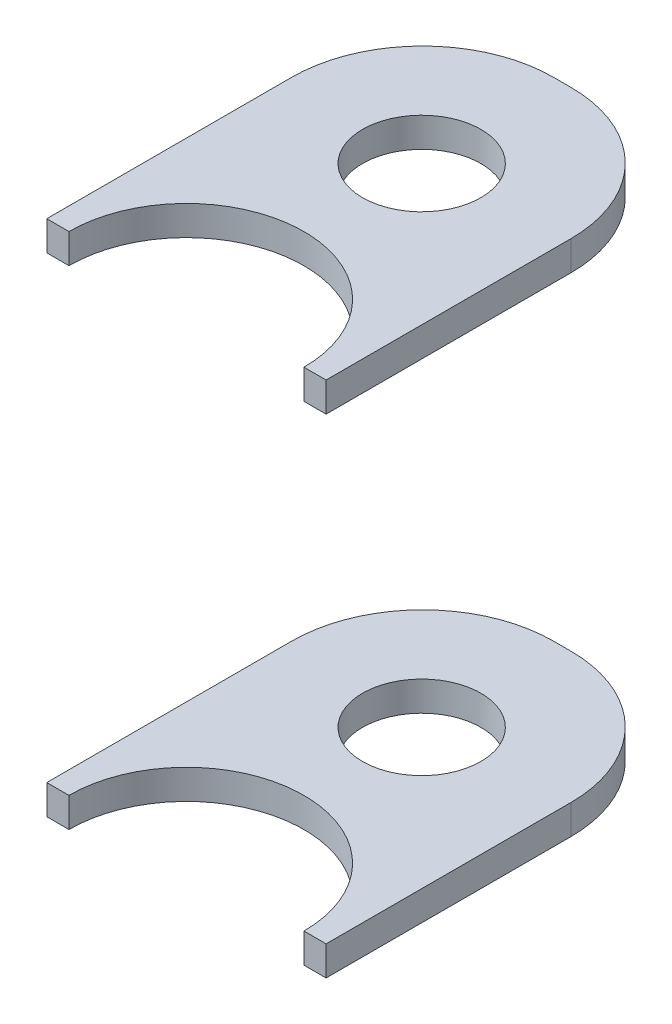
ISO-10303-21;
HEADER;
FILE_DESCRIPTION(('STEP AP214'),'2;1');
FILE_NAME('part.step','',(''),(''),'','','');
FILE_SCHEMA(('AUTOMOTIVE_DESIGN { 1 0 10303 214 1 1 1 1 }'));
ENDSEC;
DATA;
#1=APPLICATION_CONTEXT('core data for automotive mechanical design processes');
#2=APPLICATION_PROTOCOL_DEFINITION('international standard','automotive_design',2000,#1);
#3=PRODUCT_CONTEXT('',#1,'mechanical');
#4=PRODUCT('Part','Part','',(#3));
#5=PRODUCT_RELATED_PRODUCT_CATEGORY('part','',(#4));
#6=PRODUCT_DEFINITION_FORMATION('','',#4);
#7=PRODUCT_DEFINITION_CONTEXT('part definition',#1,'design');
#8=PRODUCT_DEFINITION('design','',#6,#7);
#9=PRODUCT_DEFINITION_SHAPE('','',#8);
#10=(LENGTH_UNIT() NAMED_UNIT(*) SI_UNIT(.MILLI.,.METRE.));
#11=(NAMED_UNIT(*) PLANE_ANGLE_UNIT() SI_UNIT($,.RADIAN.));
#12=(NAMED_UNIT(*) SI_UNIT($,.STERADIAN.) SOLID_ANGLE_UNIT());
#13=UNCERTAINTY_MEASURE_WITH_UNIT(LENGTH_MEASURE(1.E-05),#10,'distance_accuracy_value','');
#14=(GEOMETRIC_REPRESENTATION_CONTEXT(3) GLOBAL_UNCERTAINTY_ASSIGNED_CONTEXT((#13)) GLOBAL_UNIT_ASSIGNED_CONTEXT((#10,
#11,#12)) REPRESENTATION_CONTEXT('',''));
#15=CARTESIAN_POINT('',(0.,0.,0.));
#16=DIRECTION('',(0.,0.,1.));
#17=DIRECTION('',(1.,0.,0.));
#18=AXIS2_PLACEMENT_3D('',#15,#16,#17);
#19=CARTESIAN_POINT('',(0.,-35.,31.8));
#20=DIRECTION('',(0.,-1.,0.));
#21=DIRECTION('',(0.,0.,1.));
#22=AXIS2_PLACEMENT_3D('',#19,#20,#21);
#23=PLANE('',#22);
#24=DIRECTION('',(0.,0.,-1.));
#25=VECTOR('',#24,1.);
#26=CARTESIAN_POINT('',(18.88,-35.,-1.30100000000001));
#27=LINE('',#26,#25);
#28=CARTESIAN_POINT('',(18.88,-35.,31.8));
#29=VERTEX_POINT('',#28);
#30=CARTESIAN_POINT('',(18.88,-35.,-1.30100000000001));
#31=VERTEX_POINT('',#30);
#32=EDGE_CURVE('E167',#29,#31,#27,.T.);
#33=ORIENTED_EDGE('',*,*,#32,.F.);
#34=DIRECTION('',(1.,0.,0.));
#35=VECTOR('',#34,1.);
#36=CARTESIAN_POINT('',(18.88,-35.,31.8));
#37=LINE('',#36,#35);
#38=CARTESIAN_POINT('',(15.88,-35.,31.8));
#39=VERTEX_POINT('',#38);
#40=EDGE_CURVE('E141',#39,#29,#37,.T.);
#41=ORIENTED_EDGE('',*,*,#40,.F.);
#42=CARTESIAN_POINT('',(0.,-35.,31.8));
#43=DIRECTION('',(0.,-1.,0.));
#44=DIRECTION('',(0.,0.,1.));
#45=AXIS2_PLACEMENT_3D('',#42,#43,#44);
#46=CIRCLE('',#45,15.88);
#47=CARTESIAN_POINT('',(-15.88,-35.,31.8));
#48=VERTEX_POINT('',#47);
#49=EDGE_CURVE('E122',#48,#39,#46,.T.);
#50=ORIENTED_EDGE('',*,*,#49,.F.);
#51=DIRECTION('',(1.,0.,0.));
#52=VECTOR('',#51,1.);
#53=CARTESIAN_POINT('',(-15.88,-35.,31.8));
#54=LINE('',#53,#52);
#55=CARTESIAN_POINT('',(-18.88,-35.,31.8));
#56=VERTEX_POINT('',#55);
#57=EDGE_CURVE('E132',#56,#48,#54,.T.);
#58=ORIENTED_EDGE('',*,*,#57,.F.);
#59=DIRECTION('',(0.,0.,1.));
#60=VECTOR('',#59,1.);
#61=CARTESIAN_POINT('',(-18.88,-35.,31.8));
#62=LINE('',#61,#60);
#63=CARTESIAN_POINT('',(-18.88,-35.,-1.30100000000001));
#64=VERTEX_POINT('',#63);
#65=EDGE_CURVE('E137',#64,#56,#62,.T.);
#66=ORIENTED_EDGE('',*,*,#65,.F.);
#67=CARTESIAN_POINT('',(-1.181,-35.,-1.30100000000001));
#68=DIRECTION('',(0.,1.,0.));
#69=DIRECTION('',(0.,0.,1.));
#70=AXIS2_PLACEMENT_3D('',#67,#68,#69);
#71=CIRCLE('',#70,17.699);
#72=CARTESIAN_POINT('',(-1.181,-35.,-19.));
#73=VERTEX_POINT('',#72);
#74=EDGE_CURVE('E193',#73,#64,#71,.T.);
#75=ORIENTED_EDGE('',*,*,#74,.F.);
#76=DIRECTION('',(-1.,0.,0.));
#77=VECTOR('',#76,1.);
#78=CARTESIAN_POINT('',(-1.181,-35.,-19.));
#79=LINE('',#78,#77);
#80=CARTESIAN_POINT('',(1.181,-35.,-19.));
#81=VERTEX_POINT('',#80);
#82=EDGE_CURVE('E186',#81,#73,#79,.T.);
#83=ORIENTED_EDGE('',*,*,#82,.F.);
#84=CARTESIAN_POINT('',(1.181,-35.,-1.30100000000001));
#85=DIRECTION('',(0.,1.,0.));
#86=DIRECTION('',(0.,0.,-1.));
#87=AXIS2_PLACEMENT_3D('',#84,#85,#86);
#88=CIRCLE('',#87,17.699);
#89=EDGE_CURVE('E176',#31,#81,#88,.T.);
#90=ORIENTED_EDGE('',*,*,#89,.F.);
#91=EDGE_LOOP('',(#33,#41,#50,#58,#66,#75,#83,#90));
#92=FACE_BOUND('',#91,.T.);
#93=CARTESIAN_POINT('',(0.,-35.,0.));
#94=DIRECTION('',(0.,1.,0.));
#95=DIRECTION('',(0.,0.,1.));
#96=AXIS2_PLACEMENT_3D('',#93,#94,#95);
#97=CIRCLE('',#96,8.);
#98=CARTESIAN_POINT('',(0.,-35.,8.));
#99=VERTEX_POINT('',#98);
#100=EDGE_CURVE('E150',#99,#99,#97,.T.);
#101=ORIENTED_EDGE('',*,*,#100,.T.);
#102=EDGE_LOOP('',(#101));
#103=FACE_BOUND('',#102,.T.);
#104=ADVANCED_FACE('F49',(#92,#103),#23,.T.);
#105=CARTESIAN_POINT('',(0.,-31.,31.8));
#106=DIRECTION('',(0.,-1.,0.));
#107=DIRECTION('',(0.,0.,1.));
#108=AXIS2_PLACEMENT_3D('',#105,#106,#107);
#109=PLANE('',#108);
#110=DIRECTION('',(0.,0.,-1.));
#111=VECTOR('',#110,1.);
#112=CARTESIAN_POINT('',(18.88,-31.,-1.30100000000001));
#113=LINE('',#112,#111);
#114=CARTESIAN_POINT('',(18.88,-31.,31.8));
#115=VERTEX_POINT('',#114);
#116=CARTESIAN_POINT('',(18.88,-31.,-1.30100000000001));
#117=VERTEX_POINT('',#116);
#118=EDGE_CURVE('E146',#115,#117,#113,.T.);
#119=ORIENTED_EDGE('',*,*,#118,.T.);
#120=CARTESIAN_POINT('',(1.181,-31.,-1.30100000000001));
#121=DIRECTION('',(0.,1.,0.));
#122=DIRECTION('',(0.,0.,-1.));
#123=AXIS2_PLACEMENT_3D('',#120,#121,#122);
#124=CIRCLE('',#123,17.699);
#125=CARTESIAN_POINT('',(1.181,-31.,-19.));
#126=VERTEX_POINT('',#125);
#127=EDGE_CURVE('E149',#117,#126,#124,.T.);
#128=ORIENTED_EDGE('',*,*,#127,.T.);
#129=DIRECTION('',(-1.,0.,0.));
#130=VECTOR('',#129,1.);
#131=CARTESIAN_POINT('',(-1.181,-31.,-19.));
#132=LINE('',#131,#130);
#133=CARTESIAN_POINT('',(-1.181,-31.,-19.));
#134=VERTEX_POINT('',#133);
#135=EDGE_CURVE('E153',#126,#134,#132,.T.);
#136=ORIENTED_EDGE('',*,*,#135,.T.);
#137=CARTESIAN_POINT('',(-1.181,-31.,-1.30100000000001));
#138=DIRECTION('',(0.,1.,0.));
#139=DIRECTION('',(0.,0.,1.));
#140=AXIS2_PLACEMENT_3D('',#137,#138,#139);
#141=CIRCLE('',#140,17.699);
#142=CARTESIAN_POINT('',(-18.88,-31.,-1.30100000000001));
#143=VERTEX_POINT('',#142);
#144=EDGE_CURVE('E156',#134,#143,#141,.T.);
#145=ORIENTED_EDGE('',*,*,#144,.T.);
#146=DIRECTION('',(0.,0.,1.));
#147=VECTOR('',#146,1.);
#148=CARTESIAN_POINT('',(-18.88,-31.,31.8));
#149=LINE('',#148,#147);
#150=CARTESIAN_POINT('',(-18.88,-31.,31.8));
#151=VERTEX_POINT('',#150);
#152=EDGE_CURVE('E159',#143,#151,#149,.T.);
#153=ORIENTED_EDGE('',*,*,#152,.T.);
#154=DIRECTION('',(1.,0.,0.));
#155=VECTOR('',#154,1.);
#156=CARTESIAN_POINT('',(-15.88,-31.,31.8));
#157=LINE('',#156,#155);
#158=CARTESIAN_POINT('',(-15.88,-31.,31.8));
#159=VERTEX_POINT('',#158);
#160=EDGE_CURVE('E162',#151,#159,#157,.T.);
#161=ORIENTED_EDGE('',*,*,#160,.T.);
#162=CARTESIAN_POINT('',(0.,-31.,31.8));
#163=DIRECTION('',(0.,-1.,0.));
#164=DIRECTION('',(0.,0.,1.));
#165=AXIS2_PLACEMENT_3D('',#162,#163,#164);
#166=CIRCLE('',#165,15.88);
#167=CARTESIAN_POINT('',(15.88,-31.,31.8));
#168=VERTEX_POINT('',#167);
#169=EDGE_CURVE('E125',#159,#168,#166,.T.);
#170=ORIENTED_EDGE('',*,*,#169,.T.);
#171=DIRECTION('',(1.,0.,0.));
#172=VECTOR('',#171,1.);
#173=CARTESIAN_POINT('',(18.88,-31.,31.8));
#174=LINE('',#173,#172);
#175=EDGE_CURVE('E165',#168,#115,#174,.T.);
#176=ORIENTED_EDGE('',*,*,#175,.T.);
#177=EDGE_LOOP('',(#119,#128,#136,#145,#153,#161,#170,#176));
#178=FACE_BOUND('',#177,.T.);
#179=CARTESIAN_POINT('',(0.,-31.,0.));
#180=DIRECTION('',(0.,1.,0.));
#181=DIRECTION('',(0.,0.,1.));
#182=AXIS2_PLACEMENT_3D('',#179,#180,#181);
#183=CIRCLE('',#182,8.);
#184=CARTESIAN_POINT('',(0.,-31.,8.));
#185=VERTEX_POINT('',#184);
#186=EDGE_CURVE('E189',#185,#185,#183,.T.);
#187=ORIENTED_EDGE('',*,*,#186,.F.);
#188=EDGE_LOOP('',(#187));
#189=FACE_BOUND('',#188,.T.);
#190=ADVANCED_FACE('F183',(#178,#189),#109,.F.);
#191=CARTESIAN_POINT('',(18.88,-35.,-1.30100000000001));
#192=DIRECTION('',(-1.,0.,0.));
#193=DIRECTION('',(0.,0.,1.));
#194=AXIS2_PLACEMENT_3D('',#191,#192,#193);
#195=PLANE('',#194);
#196=ORIENTED_EDGE('',*,*,#118,.F.);
#197=DIRECTION('',(0.,1.,0.));
#198=VECTOR('',#197,1.);
#199=CARTESIAN_POINT('',(18.88,-35.,31.8));
#200=LINE('',#199,#198);
#201=EDGE_CURVE('E66',#29,#115,#200,.T.);
#202=ORIENTED_EDGE('',*,*,#201,.F.);
#203=ORIENTED_EDGE('',*,*,#32,.T.);
#204=DIRECTION('',(0.,1.,0.));
#205=VECTOR('',#204,1.);
#206=CARTESIAN_POINT('',(18.88,-35.,-1.30100000000001));
#207=LINE('',#206,#205);
#208=EDGE_CURVE('E12',#31,#117,#207,.T.);
#209=ORIENTED_EDGE('',*,*,#208,.T.);
#210=EDGE_LOOP('',(#196,#202,#203,#209));
#211=FACE_BOUND('',#210,.T.);
#212=ADVANCED_FACE('F51',(#211),#195,.F.);
#213=CARTESIAN_POINT('',(1.181,-35.,-1.30100000000001));
#214=DIRECTION('',(0.,1.,0.));
#215=DIRECTION('',(0.,0.,-1.));
#216=AXIS2_PLACEMENT_3D('',#213,#214,#215);
#217=CYLINDRICAL_SURFACE('',#216,17.699);
#218=ORIENTED_EDGE('',*,*,#127,.F.);
#219=ORIENTED_EDGE('',*,*,#208,.F.);
#220=ORIENTED_EDGE('',*,*,#89,.T.);
#221=DIRECTION('',(0.,1.,0.));
#222=VECTOR('',#221,1.);
#223=CARTESIAN_POINT('',(1.181,-35.,-19.));
#224=LINE('',#223,#222);
#225=EDGE_CURVE('E58',#81,#126,#224,.T.);
#226=ORIENTED_EDGE('',*,*,#225,.T.);
#227=EDGE_LOOP('',(#218,#219,#220,#226));
#228=FACE_BOUND('',#227,.T.);
#229=ADVANCED_FACE('F175',(#228),#217,.T.);
#230=CARTESIAN_POINT('',(-1.181,-35.,-19.));
#231=DIRECTION('',(0.,0.,1.));
#232=DIRECTION('',(1.,0.,0.));
#233=AXIS2_PLACEMENT_3D('',#230,#231,#232);
#234=PLANE('',#233);
#235=ORIENTED_EDGE('',*,*,#135,.F.);
#236=ORIENTED_EDGE('',*,*,#225,.F.);
#237=ORIENTED_EDGE('',*,*,#82,.T.);
#238=DIRECTION('',(0.,1.,0.));
#239=VECTOR('',#238,1.);
#240=CARTESIAN_POINT('',(-1.181,-35.,-19.));
#241=LINE('',#240,#239);
#242=EDGE_CURVE('E173',#73,#134,#241,.T.);
#243=ORIENTED_EDGE('',*,*,#242,.T.);
#244=EDGE_LOOP('',(#235,#236,#237,#243));
#245=FACE_BOUND('',#244,.T.);
#246=ADVANCED_FACE('F180',(#245),#234,.F.);
#247=CARTESIAN_POINT('',(-1.181,-35.,-1.30100000000001));
#248=DIRECTION('',(0.,1.,0.));
#249=DIRECTION('',(0.,0.,-1.));
#250=AXIS2_PLACEMENT_3D('',#247,#248,#249);
#251=CYLINDRICAL_SURFACE('',#250,17.699);
#252=ORIENTED_EDGE('',*,*,#144,.F.);
#253=ORIENTED_EDGE('',*,*,#242,.F.);
#254=ORIENTED_EDGE('',*,*,#74,.T.);
#255=DIRECTION('',(0.,1.,0.));
#256=VECTOR('',#255,1.);
#257=CARTESIAN_POINT('',(-18.88,-35.,-1.30100000000001));
#258=LINE('',#257,#256);
#259=EDGE_CURVE('E171',#64,#143,#258,.T.);
#260=ORIENTED_EDGE('',*,*,#259,.T.);
#261=EDGE_LOOP('',(#252,#253,#254,#260));
#262=FACE_BOUND('',#261,.T.);
#263=ADVANCED_FACE('F200',(#262),#251,.T.);
#264=CARTESIAN_POINT('',(-18.88,-35.,31.8));
#265=DIRECTION('',(1.,0.,0.));
#266=DIRECTION('',(0.,0.,-1.));
#267=AXIS2_PLACEMENT_3D('',#264,#265,#266);
#268=PLANE('',#267);
#269=ORIENTED_EDGE('',*,*,#152,.F.);
#270=ORIENTED_EDGE('',*,*,#259,.F.);
#271=ORIENTED_EDGE('',*,*,#65,.T.);
#272=DIRECTION('',(0.,1.,0.));
#273=VECTOR('',#272,1.);
#274=CARTESIAN_POINT('',(-18.88,-35.,31.8));
#275=LINE('',#274,#273);
#276=EDGE_CURVE('E129',#56,#151,#275,.T.);
#277=ORIENTED_EDGE('',*,*,#276,.T.);
#278=EDGE_LOOP('',(#269,#270,#271,#277));
#279=FACE_BOUND('',#278,.T.);
#280=ADVANCED_FACE('F197',(#279),#268,.F.);
#281=CARTESIAN_POINT('',(-15.88,-35.,31.8));
#282=DIRECTION('',(0.,0.,-1.));
#283=DIRECTION('',(-1.,0.,0.));
#284=AXIS2_PLACEMENT_3D('',#281,#282,#283);
#285=PLANE('',#284);
#286=ORIENTED_EDGE('',*,*,#160,.F.);
#287=ORIENTED_EDGE('',*,*,#276,.F.);
#288=ORIENTED_EDGE('',*,*,#57,.T.);
#289=DIRECTION('',(0.,1.,0.));
#290=VECTOR('',#289,1.);
#291=CARTESIAN_POINT('',(-15.88,-35.,31.8));
#292=LINE('',#291,#290);
#293=EDGE_CURVE('E118',#48,#159,#292,.T.);
#294=ORIENTED_EDGE('',*,*,#293,.T.);
#295=EDGE_LOOP('',(#286,#287,#288,#294));
#296=FACE_BOUND('',#295,.T.);
#297=ADVANCED_FACE('F133',(#296),#285,.F.);
#298=CARTESIAN_POINT('',(0.,-35.,31.8));
#299=DIRECTION('',(0.,1.,0.));
#300=DIRECTION('',(0.,0.,-1.));
#301=AXIS2_PLACEMENT_3D('',#298,#299,#300);
#302=CYLINDRICAL_SURFACE('',#301,15.88);
#303=ORIENTED_EDGE('',*,*,#169,.F.);
#304=ORIENTED_EDGE('',*,*,#293,.F.);
#305=ORIENTED_EDGE('',*,*,#49,.T.);
#306=DIRECTION('',(0.,1.,0.));
#307=VECTOR('',#306,1.);
#308=CARTESIAN_POINT('',(15.88,-35.,31.8));
#309=LINE('',#308,#307);
#310=EDGE_CURVE('E94',#39,#168,#309,.T.);
#311=ORIENTED_EDGE('',*,*,#310,.T.);
#312=EDGE_LOOP('',(#303,#304,#305,#311));
#313=FACE_BOUND('',#312,.T.);
#314=ADVANCED_FACE('F120',(#313),#302,.F.);
#315=CARTESIAN_POINT('',(18.88,-35.,31.8));
#316=DIRECTION('',(0.,0.,-1.));
#317=DIRECTION('',(-1.,0.,0.));
#318=AXIS2_PLACEMENT_3D('',#315,#316,#317);
#319=PLANE('',#318);
#320=ORIENTED_EDGE('',*,*,#175,.F.);
#321=ORIENTED_EDGE('',*,*,#310,.F.);
#322=ORIENTED_EDGE('',*,*,#40,.T.);
#323=ORIENTED_EDGE('',*,*,#201,.T.);
#324=EDGE_LOOP('',(#320,#321,#322,#323));
#325=FACE_BOUND('',#324,.T.);
#326=ADVANCED_FACE('F218',(#325),#319,.F.);
#327=CARTESIAN_POINT('',(0.,-35.,0.));
#328=DIRECTION('',(0.,1.,0.));
#329=DIRECTION('',(0.,0.,-1.));
#330=AXIS2_PLACEMENT_3D('',#327,#328,#329);
#331=CYLINDRICAL_SURFACE('',#330,8.);
#332=ORIENTED_EDGE('',*,*,#100,.F.);
#333=EDGE_LOOP('',(#332));
#334=FACE_BOUND('',#333,.T.);
#335=ORIENTED_EDGE('',*,*,#186,.T.);
#336=EDGE_LOOP('',(#335));
#337=FACE_BOUND('',#336,.T.);
#338=ADVANCED_FACE('F216',(#334,#337),#331,.F.);
#339=CLOSED_SHELL('',(#104,#190,#212,#229,#246,#263,#280,#297,#314,#326,#338));
#340=MANIFOLD_SOLID_BREP('B2',#339);
#341=CARTESIAN_POINT('',(0.,35.,31.8));
#342=DIRECTION('',(0.,1.,0.));
#343=DIRECTION('',(0.,0.,1.));
#344=AXIS2_PLACEMENT_3D('',#341,#342,#343);
#345=PLANE('',#344);
#346=DIRECTION('',(0.,0.,-1.));
#347=VECTOR('',#346,1.);
#348=CARTESIAN_POINT('',(18.88,35.,-1.30100000000001));
#349=LINE('',#348,#347);
#350=CARTESIAN_POINT('',(18.88,35.,31.8));
#351=VERTEX_POINT('',#350);
#352=CARTESIAN_POINT('',(18.88,35.,-1.30100000000001));
#353=VERTEX_POINT('',#352);
#354=EDGE_CURVE('E454',#351,#353,#349,.T.);
#355=ORIENTED_EDGE('',*,*,#354,.T.);
#356=CARTESIAN_POINT('',(1.181,35.,-1.30100000000001));
#357=DIRECTION('',(0.,1.,0.));
#358=DIRECTION('',(0.,0.,-1.));
#359=AXIS2_PLACEMENT_3D('',#356,#357,#358);
#360=CIRCLE('',#359,17.699);
#361=CARTESIAN_POINT('',(1.181,35.,-19.));
#362=VERTEX_POINT('',#361);
#363=EDGE_CURVE('E402',#353,#362,#360,.T.);
#364=ORIENTED_EDGE('',*,*,#363,.T.);
#365=DIRECTION('',(-1.,0.,0.));
#366=VECTOR('',#365,1.);
#367=CARTESIAN_POINT('',(-1.181,35.,-19.));
#368=LINE('',#367,#366);
#369=CARTESIAN_POINT('',(-1.181,35.,-19.));
#370=VERTEX_POINT('',#369);
#371=EDGE_CURVE('E469',#362,#370,#368,.T.);
#372=ORIENTED_EDGE('',*,*,#371,.T.);
#373=CARTESIAN_POINT('',(-1.181,35.,-1.30100000000001));
#374=DIRECTION('',(0.,1.,0.));
#375=DIRECTION('',(0.,0.,1.));
#376=AXIS2_PLACEMENT_3D('',#373,#374,#375);
#377=CIRCLE('',#376,17.699);
#378=CARTESIAN_POINT('',(-18.88,35.,-1.30100000000001));
#379=VERTEX_POINT('',#378);
#380=EDGE_CURVE('E482',#370,#379,#377,.T.);
#381=ORIENTED_EDGE('',*,*,#380,.T.);
#382=DIRECTION('',(0.,0.,1.));
#383=VECTOR('',#382,1.);
#384=CARTESIAN_POINT('',(-18.88,35.,31.8));
#385=LINE('',#384,#383);
#386=CARTESIAN_POINT('',(-18.88,35.,31.8));
#387=VERTEX_POINT('',#386);
#388=EDGE_CURVE('E421',#379,#387,#385,.T.);
#389=ORIENTED_EDGE('',*,*,#388,.T.);
#390=DIRECTION('',(1.,0.,0.));
#391=VECTOR('',#390,1.);
#392=CARTESIAN_POINT('',(-15.88,35.,31.8));
#393=LINE('',#392,#391);
#394=CARTESIAN_POINT('',(-15.88,35.,31.8));
#395=VERTEX_POINT('',#394);
#396=EDGE_CURVE('E415',#387,#395,#393,.T.);
#397=ORIENTED_EDGE('',*,*,#396,.T.);
#398=CARTESIAN_POINT('',(0.,35.,31.8));
#399=DIRECTION('',(0.,-1.,0.));
#400=DIRECTION('',(0.,0.,1.));
#401=AXIS2_PLACEMENT_3D('',#398,#399,#400);
#402=CIRCLE('',#401,15.88);
#403=CARTESIAN_POINT('',(15.88,35.,31.8));
#404=VERTEX_POINT('',#403);
#405=EDGE_CURVE('E419',#395,#404,#402,.T.);
#406=ORIENTED_EDGE('',*,*,#405,.T.);
#407=DIRECTION('',(1.,0.,0.));
#408=VECTOR('',#407,1.);
#409=CARTESIAN_POINT('',(18.88,35.,31.8));
#410=LINE('',#409,#408);
#411=EDGE_CURVE('E359',#404,#351,#410,.T.);
#412=ORIENTED_EDGE('',*,*,#411,.T.);
#413=EDGE_LOOP('',(#355,#364,#372,#381,#389,#397,#406,#412));
#414=FACE_BOUND('',#413,.T.);
#415=CARTESIAN_POINT('',(0.,35.,0.));
#416=DIRECTION('',(0.,1.,0.));
#417=DIRECTION('',(0.,0.,1.));
#418=AXIS2_PLACEMENT_3D('',#415,#416,#417);
#419=CIRCLE('',#418,8.);
#420=CARTESIAN_POINT('',(0.,35.,8.));
#421=VERTEX_POINT('',#420);
#422=EDGE_CURVE('E443',#421,#421,#419,.T.);
#423=ORIENTED_EDGE('',*,*,#422,.F.);
#424=EDGE_LOOP('',(#423));
#425=FACE_BOUND('',#424,.T.);
#426=ADVANCED_FACE('F342',(#414,#425),#345,.T.);
#427=CARTESIAN_POINT('',(0.,31.,31.8));
#428=DIRECTION('',(0.,1.,0.));
#429=DIRECTION('',(0.,0.,1.));
#430=AXIS2_PLACEMENT_3D('',#427,#428,#429);
#431=PLANE('',#430);
#432=DIRECTION('',(0.,0.,-1.));
#433=VECTOR('',#432,1.);
#434=CARTESIAN_POINT('',(18.88,31.,-1.30100000000001));
#435=LINE('',#434,#433);
#436=CARTESIAN_POINT('',(18.88,31.,31.8));
#437=VERTEX_POINT('',#436);
#438=CARTESIAN_POINT('',(18.88,31.,-1.30100000000001));
#439=VERTEX_POINT('',#438);
#440=EDGE_CURVE('E439',#437,#439,#435,.T.);
#441=ORIENTED_EDGE('',*,*,#440,.F.);
#442=DIRECTION('',(1.,0.,0.));
#443=VECTOR('',#442,1.);
#444=CARTESIAN_POINT('',(18.88,31.,31.8));
#445=LINE('',#444,#443);
#446=CARTESIAN_POINT('',(15.88,31.,31.8));
#447=VERTEX_POINT('',#446);
#448=EDGE_CURVE('E394',#447,#437,#445,.T.);
#449=ORIENTED_EDGE('',*,*,#448,.F.);
#450=CARTESIAN_POINT('',(0.,31.,31.8));
#451=DIRECTION('',(0.,-1.,0.));
#452=DIRECTION('',(0.,0.,1.));
#453=AXIS2_PLACEMENT_3D('',#450,#451,#452);
#454=CIRCLE('',#453,15.88);
#455=CARTESIAN_POINT('',(-15.88,31.,31.8));
#456=VERTEX_POINT('',#455);
#457=EDGE_CURVE('E388',#456,#447,#454,.T.);
#458=ORIENTED_EDGE('',*,*,#457,.F.);
#459=DIRECTION('',(1.,0.,0.));
#460=VECTOR('',#459,1.);
#461=CARTESIAN_POINT('',(-15.88,31.,31.8));
#462=LINE('',#461,#460);
#463=CARTESIAN_POINT('',(-18.88,31.,31.8));
#464=VERTEX_POINT('',#463);
#465=EDGE_CURVE('E429',#464,#456,#462,.T.);
#466=ORIENTED_EDGE('',*,*,#465,.F.);
#467=DIRECTION('',(0.,0.,1.));
#468=VECTOR('',#467,1.);
#469=CARTESIAN_POINT('',(-18.88,31.,31.8));
#470=LINE('',#469,#468);
#471=CARTESIAN_POINT('',(-18.88,31.,-1.30100000000001));
#472=VERTEX_POINT('',#471);
#473=EDGE_CURVE('E449',#472,#464,#470,.T.);
#474=ORIENTED_EDGE('',*,*,#473,.F.);
#475=CARTESIAN_POINT('',(-1.181,31.,-1.30100000000001));
#476=DIRECTION('',(0.,1.,0.));
#477=DIRECTION('',(0.,0.,1.));
#478=AXIS2_PLACEMENT_3D('',#475,#476,#477);
#479=CIRCLE('',#478,17.699);
#480=CARTESIAN_POINT('',(-1.181,31.,-19.));
#481=VERTEX_POINT('',#480);
#482=EDGE_CURVE('E447',#481,#472,#479,.T.);
#483=ORIENTED_EDGE('',*,*,#482,.F.);
#484=DIRECTION('',(-1.,0.,0.));
#485=VECTOR('',#484,1.);
#486=CARTESIAN_POINT('',(-1.181,31.,-19.));
#487=LINE('',#486,#485);
#488=CARTESIAN_POINT('',(1.181,31.,-19.));
#489=VERTEX_POINT('',#488);
#490=EDGE_CURVE('E445',#489,#481,#487,.T.);
#491=ORIENTED_EDGE('',*,*,#490,.F.);
#492=CARTESIAN_POINT('',(1.181,31.,-1.30100000000001));
#493=DIRECTION('',(0.,1.,0.));
#494=DIRECTION('',(0.,0.,-1.));
#495=AXIS2_PLACEMENT_3D('',#492,#493,#494);
#496=CIRCLE('',#495,17.699);
#497=EDGE_CURVE('E442',#439,#489,#496,.T.);
#498=ORIENTED_EDGE('',*,*,#497,.F.);
#499=EDGE_LOOP('',(#441,#449,#458,#466,#474,#483,#491,#498));
#500=FACE_BOUND('',#499,.T.);
#501=CARTESIAN_POINT('',(0.,31.,0.));
#502=DIRECTION('',(0.,1.,0.));
#503=DIRECTION('',(0.,0.,1.));
#504=AXIS2_PLACEMENT_3D('',#501,#502,#503);
#505=CIRCLE('',#504,8.);
#506=CARTESIAN_POINT('',(0.,31.,8.));
#507=VERTEX_POINT('',#506);
#508=EDGE_CURVE('E488',#507,#507,#505,.T.);
#509=ORIENTED_EDGE('',*,*,#508,.T.);
#510=EDGE_LOOP('',(#509));
#511=FACE_BOUND('',#510,.T.);
#512=ADVANCED_FACE('F473',(#500,#511),#431,.F.);
#513=CARTESIAN_POINT('',(18.88,35.,-1.30100000000001));
#514=DIRECTION('',(-1.,0.,0.));
#515=DIRECTION('',(0.,0.,1.));
#516=AXIS2_PLACEMENT_3D('',#513,#514,#515);
#517=PLANE('',#516);
#518=ORIENTED_EDGE('',*,*,#440,.T.);
#519=DIRECTION('',(0.,-1.,0.));
#520=VECTOR('',#519,1.);
#521=CARTESIAN_POINT('',(18.88,35.,-1.30100000000001));
#522=LINE('',#521,#520);
#523=EDGE_CURVE('E47',#353,#439,#522,.T.);
#524=ORIENTED_EDGE('',*,*,#523,.F.);
#525=ORIENTED_EDGE('',*,*,#354,.F.);
#526=DIRECTION('',(0.,-1.,0.));
#527=VECTOR('',#526,1.);
#528=CARTESIAN_POINT('',(18.88,35.,31.8));
#529=LINE('',#528,#527);
#530=EDGE_CURVE('E435',#351,#437,#529,.T.);
#531=ORIENTED_EDGE('',*,*,#530,.T.);
#532=EDGE_LOOP('',(#518,#524,#525,#531));
#533=FACE_BOUND('',#532,.T.);
#534=ADVANCED_FACE('F344',(#533),#517,.F.);
#535=CARTESIAN_POINT('',(1.181,35.,-1.30100000000001));
#536=DIRECTION('',(0.,-1.,0.));
#537=DIRECTION('',(0.,0.,-1.));
#538=AXIS2_PLACEMENT_3D('',#535,#536,#537);
#539=CYLINDRICAL_SURFACE('',#538,17.699);
#540=ORIENTED_EDGE('',*,*,#497,.T.);
#541=DIRECTION('',(0.,-1.,0.));
#542=VECTOR('',#541,1.);
#543=CARTESIAN_POINT('',(1.181,35.,-19.));
#544=LINE('',#543,#542);
#545=EDGE_CURVE('E351',#362,#489,#544,.T.);
#546=ORIENTED_EDGE('',*,*,#545,.F.);
#547=ORIENTED_EDGE('',*,*,#363,.F.);
#548=ORIENTED_EDGE('',*,*,#523,.T.);
#549=EDGE_LOOP('',(#540,#546,#547,#548));
#550=FACE_BOUND('',#549,.T.);
#551=ADVANCED_FACE('F516',(#550),#539,.T.);
#552=CARTESIAN_POINT('',(-1.181,35.,-19.));
#553=DIRECTION('',(0.,0.,1.));
#554=DIRECTION('',(1.,0.,0.));
#555=AXIS2_PLACEMENT_3D('',#552,#553,#554);
#556=PLANE('',#555);
#557=ORIENTED_EDGE('',*,*,#490,.T.);
#558=DIRECTION('',(0.,-1.,0.));
#559=VECTOR('',#558,1.);
#560=CARTESIAN_POINT('',(-1.181,35.,-19.));
#561=LINE('',#560,#559);
#562=EDGE_CURVE('E461',#370,#481,#561,.T.);
#563=ORIENTED_EDGE('',*,*,#562,.F.);
#564=ORIENTED_EDGE('',*,*,#371,.F.);
#565=ORIENTED_EDGE('',*,*,#545,.T.);
#566=EDGE_LOOP('',(#557,#563,#564,#565));
#567=FACE_BOUND('',#566,.T.);
#568=ADVANCED_FACE('F467',(#567),#556,.F.);
#569=CARTESIAN_POINT('',(-1.181,35.,-1.30100000000001));
#570=DIRECTION('',(0.,-1.,0.));
#571=DIRECTION('',(0.,0.,-1.));
#572=AXIS2_PLACEMENT_3D('',#569,#570,#571);
#573=CYLINDRICAL_SURFACE('',#572,17.699);
#574=ORIENTED_EDGE('',*,*,#482,.T.);
#575=DIRECTION('',(0.,-1.,0.));
#576=VECTOR('',#575,1.);
#577=CARTESIAN_POINT('',(-18.88,35.,-1.30100000000001));
#578=LINE('',#577,#576);
#579=EDGE_CURVE('E458',#379,#472,#578,.T.);
#580=ORIENTED_EDGE('',*,*,#579,.F.);
#581=ORIENTED_EDGE('',*,*,#380,.F.);
#582=ORIENTED_EDGE('',*,*,#562,.T.);
#583=EDGE_LOOP('',(#574,#580,#581,#582));
#584=FACE_BOUND('',#583,.T.);
#585=ADVANCED_FACE('F478',(#584),#573,.T.);
#586=CARTESIAN_POINT('',(-18.88,35.,31.8));
#587=DIRECTION('',(1.,0.,0.));
#588=DIRECTION('',(0.,0.,-1.));
#589=AXIS2_PLACEMENT_3D('',#586,#587,#588);
#590=PLANE('',#589);
#591=ORIENTED_EDGE('',*,*,#473,.T.);
#592=DIRECTION('',(0.,-1.,0.));
#593=VECTOR('',#592,1.);
#594=CARTESIAN_POINT('',(-18.88,35.,31.8));
#595=LINE('',#594,#593);
#596=EDGE_CURVE('E430',#387,#464,#595,.T.);
#597=ORIENTED_EDGE('',*,*,#596,.F.);
#598=ORIENTED_EDGE('',*,*,#388,.F.);
#599=ORIENTED_EDGE('',*,*,#579,.T.);
#600=EDGE_LOOP('',(#591,#597,#598,#599));
#601=FACE_BOUND('',#600,.T.);
#602=ADVANCED_FACE('F481',(#601),#590,.F.);
#603=CARTESIAN_POINT('',(-15.88,35.,31.8));
#604=DIRECTION('',(0.,0.,-1.));
#605=DIRECTION('',(-1.,0.,0.));
#606=AXIS2_PLACEMENT_3D('',#603,#604,#605);
#607=PLANE('',#606);
#608=ORIENTED_EDGE('',*,*,#465,.T.);
#609=DIRECTION('',(0.,-1.,0.));
#610=VECTOR('',#609,1.);
#611=CARTESIAN_POINT('',(-15.88,35.,31.8));
#612=LINE('',#611,#610);
#613=EDGE_CURVE('E426',#395,#456,#612,.T.);
#614=ORIENTED_EDGE('',*,*,#613,.F.);
#615=ORIENTED_EDGE('',*,*,#396,.F.);
#616=ORIENTED_EDGE('',*,*,#596,.T.);
#617=EDGE_LOOP('',(#608,#614,#615,#616));
#618=FACE_BOUND('',#617,.T.);
#619=ADVANCED_FACE('F427',(#618),#607,.F.);
#620=CARTESIAN_POINT('',(0.,35.,31.8));
#621=DIRECTION('',(0.,-1.,0.));
#622=DIRECTION('',(0.,0.,-1.));
#623=AXIS2_PLACEMENT_3D('',#620,#621,#622);
#624=CYLINDRICAL_SURFACE('',#623,15.88);
#625=ORIENTED_EDGE('',*,*,#457,.T.);
#626=DIRECTION('',(0.,-1.,0.));
#627=VECTOR('',#626,1.);
#628=CARTESIAN_POINT('',(15.88,35.,31.8));
#629=LINE('',#628,#627);
#630=EDGE_CURVE('E431',#404,#447,#629,.T.);
#631=ORIENTED_EDGE('',*,*,#630,.F.);
#632=ORIENTED_EDGE('',*,*,#405,.F.);
#633=ORIENTED_EDGE('',*,*,#613,.T.);
#634=EDGE_LOOP('',(#625,#631,#632,#633));
#635=FACE_BOUND('',#634,.T.);
#636=ADVANCED_FACE('F433',(#635),#624,.F.);
#637=CARTESIAN_POINT('',(18.88,35.,31.8));
#638=DIRECTION('',(0.,0.,-1.));
#639=DIRECTION('',(-1.,0.,0.));
#640=AXIS2_PLACEMENT_3D('',#637,#638,#639);
#641=PLANE('',#640);
#642=ORIENTED_EDGE('',*,*,#448,.T.);
#643=ORIENTED_EDGE('',*,*,#530,.F.);
#644=ORIENTED_EDGE('',*,*,#411,.F.);
#645=ORIENTED_EDGE('',*,*,#630,.T.);
#646=EDGE_LOOP('',(#642,#643,#644,#645));
#647=FACE_BOUND('',#646,.T.);
#648=ADVANCED_FACE('F504',(#647),#641,.F.);
#649=CARTESIAN_POINT('',(0.,35.,0.));
#650=DIRECTION('',(0.,-1.,0.));
#651=DIRECTION('',(0.,0.,-1.));
#652=AXIS2_PLACEMENT_3D('',#649,#650,#651);
#653=CYLINDRICAL_SURFACE('',#652,8.);
#654=ORIENTED_EDGE('',*,*,#422,.T.);
#655=EDGE_LOOP('',(#654));
#656=FACE_BOUND('',#655,.T.);
#657=ORIENTED_EDGE('',*,*,#508,.F.);
#658=EDGE_LOOP('',(#657));
#659=FACE_BOUND('',#658,.T.);
#660=ADVANCED_FACE('F494',(#656,#659),#653,.F.);
#661=CLOSED_SHELL('',(#426,#512,#534,#551,#568,#585,#602,#619,#636,#648,#660));
#662=MANIFOLD_SOLID_BREP('B6',#661);
#663=ADVANCED_BREP_SHAPE_REPRESENTATION('',(#18,#340,#662),#14);
#664=SHAPE_DEFINITION_REPRESENTATION(#9,#663);
ENDSEC;
END-ISO-10303-21;
